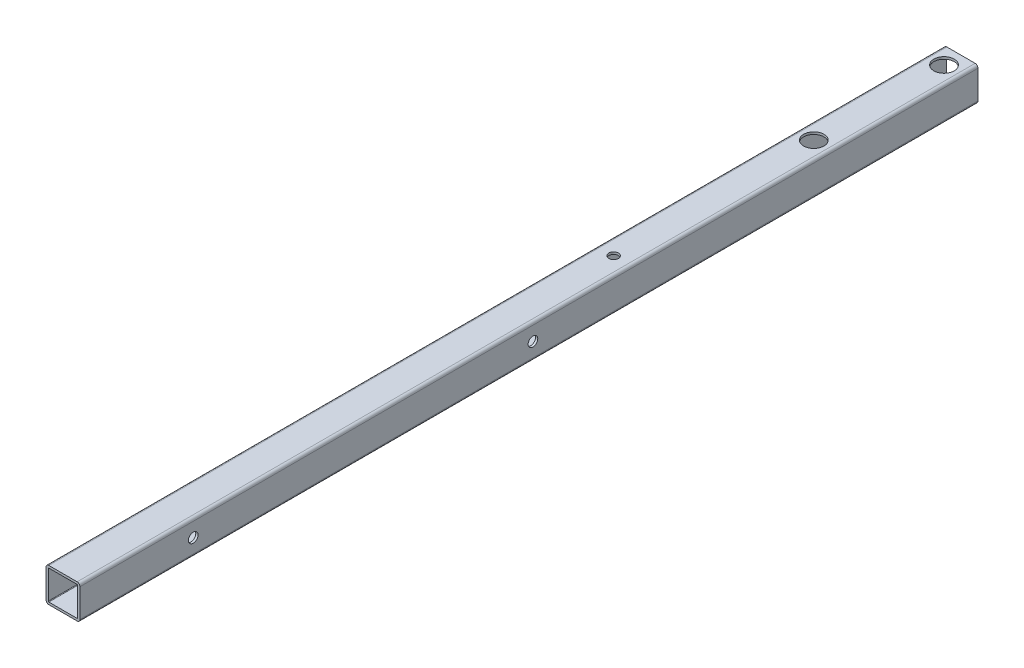
ISO-10303-21;
HEADER;
FILE_DESCRIPTION(('STEP AP214'),'2;1');
FILE_NAME('part.step','',(''),(''),'','','');
FILE_SCHEMA(('AUTOMOTIVE_DESIGN { 1 0 10303 214 1 1 1 1 }'));
ENDSEC;
DATA;
#1=APPLICATION_CONTEXT('core data for automotive mechanical design processes');
#2=APPLICATION_PROTOCOL_DEFINITION('international standard','automotive_design',2000,#1);
#3=PRODUCT_CONTEXT('',#1,'mechanical');
#4=PRODUCT('Part','Part','',(#3));
#5=PRODUCT_RELATED_PRODUCT_CATEGORY('part','',(#4));
#6=PRODUCT_DEFINITION_FORMATION('','',#4);
#7=PRODUCT_DEFINITION_CONTEXT('part definition',#1,'design');
#8=PRODUCT_DEFINITION('design','',#6,#7);
#9=PRODUCT_DEFINITION_SHAPE('','',#8);
#10=(LENGTH_UNIT() NAMED_UNIT(*) SI_UNIT(.MILLI.,.METRE.));
#11=(NAMED_UNIT(*) PLANE_ANGLE_UNIT() SI_UNIT($,.RADIAN.));
#12=(NAMED_UNIT(*) SI_UNIT($,.STERADIAN.) SOLID_ANGLE_UNIT());
#13=UNCERTAINTY_MEASURE_WITH_UNIT(LENGTH_MEASURE(1.E-05),#10,'distance_accuracy_value','');
#14=(GEOMETRIC_REPRESENTATION_CONTEXT(3) GLOBAL_UNCERTAINTY_ASSIGNED_CONTEXT((#13)) GLOBAL_UNIT_ASSIGNED_CONTEXT((#10,
#11,#12)) REPRESENTATION_CONTEXT('',''));
#15=CARTESIAN_POINT('',(0.,0.,0.));
#16=DIRECTION('',(0.,0.,1.));
#17=DIRECTION('',(1.,0.,0.));
#18=AXIS2_PLACEMENT_3D('',#15,#16,#17);
#19=CARTESIAN_POINT('',(0.0233047033624929,-15.,-89.7233047033634));
#20=DIRECTION('',(0.,-1.,0.));
#21=DIRECTION('',(0.,0.,-1.));
#22=AXIS2_PLACEMENT_3D('',#19,#20,#21);
#23=CYLINDRICAL_SURFACE('',#22,4.25);
#24=CARTESIAN_POINT('',(0.0233047033624929,-13.,-89.7233047033634));
#25=DIRECTION('',(0.,-1.,0.));
#26=DIRECTION('',(0.,0.,-1.));
#27=AXIS2_PLACEMENT_3D('',#24,#25,#26);
#28=CIRCLE('',#27,4.25);
#29=CARTESIAN_POINT('',(0.0233047033624929,-13.,-93.9733047033634));
#30=VERTEX_POINT('',#29);
#31=EDGE_CURVE('E180',#30,#30,#28,.T.);
#32=ORIENTED_EDGE('',*,*,#31,.F.);
#33=EDGE_LOOP('',(#32));
#34=FACE_BOUND('',#33,.T.);
#35=CARTESIAN_POINT('',(0.0233047033624929,-15.,-89.7233047033634));
#36=DIRECTION('',(0.,-1.,0.));
#37=DIRECTION('',(0.,0.,-1.));
#38=AXIS2_PLACEMENT_3D('',#35,#36,#37);
#39=CIRCLE('',#38,4.25);
#40=CARTESIAN_POINT('',(0.0233047033624929,-15.,-93.9733047033634));
#41=VERTEX_POINT('',#40);
#42=EDGE_CURVE('E186',#41,#41,#39,.T.);
#43=ORIENTED_EDGE('',*,*,#42,.T.);
#44=EDGE_LOOP('',(#43));
#45=FACE_BOUND('',#44,.T.);
#46=ADVANCED_FACE('F16',(#34,#45),#23,.F.);
#47=CARTESIAN_POINT('',(0.,-15.,-266.5));
#48=DIRECTION('',(0.,1.,0.));
#49=DIRECTION('',(0.,0.,1.));
#50=AXIS2_PLACEMENT_3D('',#47,#48,#49);
#51=CYLINDRICAL_SURFACE('',#50,4.25000000000003);
#52=CARTESIAN_POINT('',(0.,-13.,-266.5));
#53=DIRECTION('',(0.,1.,0.));
#54=DIRECTION('',(0.,0.,1.));
#55=AXIS2_PLACEMENT_3D('',#52,#53,#54);
#56=CIRCLE('',#55,4.25000000000003);
#57=CARTESIAN_POINT('',(0.,-13.,-262.25));
#58=VERTEX_POINT('',#57);
#59=EDGE_CURVE('E248',#58,#58,#56,.F.);
#60=ORIENTED_EDGE('',*,*,#59,.F.);
#61=EDGE_LOOP('',(#60));
#62=FACE_BOUND('',#61,.T.);
#63=CARTESIAN_POINT('',(0.,-15.,-266.5));
#64=DIRECTION('',(0.,1.,0.));
#65=DIRECTION('',(0.,0.,1.));
#66=AXIS2_PLACEMENT_3D('',#63,#64,#65);
#67=CIRCLE('',#66,4.25000000000003);
#68=CARTESIAN_POINT('',(0.,-15.,-262.25));
#69=VERTEX_POINT('',#68);
#70=EDGE_CURVE('E255',#69,#69,#67,.F.);
#71=ORIENTED_EDGE('',*,*,#70,.T.);
#72=EDGE_LOOP('',(#71));
#73=FACE_BOUND('',#72,.T.);
#74=ADVANCED_FACE('F585',(#62,#73),#51,.F.);
#75=CARTESIAN_POINT('',(0.,-15.,-381.5));
#76=DIRECTION('',(0.,1.,0.));
#77=DIRECTION('',(0.,0.,1.));
#78=AXIS2_PLACEMENT_3D('',#75,#76,#77);
#79=CYLINDRICAL_SURFACE('',#78,4.25000000000003);
#80=CARTESIAN_POINT('',(0.,-13.,-381.5));
#81=DIRECTION('',(0.,1.,0.));
#82=DIRECTION('',(0.,0.,1.));
#83=AXIS2_PLACEMENT_3D('',#80,#81,#82);
#84=CIRCLE('',#83,4.25000000000003);
#85=CARTESIAN_POINT('',(0.,-13.,-377.25));
#86=VERTEX_POINT('',#85);
#87=EDGE_CURVE('E131',#86,#86,#84,.F.);
#88=ORIENTED_EDGE('',*,*,#87,.F.);
#89=EDGE_LOOP('',(#88));
#90=FACE_BOUND('',#89,.T.);
#91=CARTESIAN_POINT('',(0.,-15.,-381.5));
#92=DIRECTION('',(0.,1.,0.));
#93=DIRECTION('',(0.,0.,1.));
#94=AXIS2_PLACEMENT_3D('',#91,#92,#93);
#95=CIRCLE('',#94,4.25000000000003);
#96=CARTESIAN_POINT('',(0.,-15.,-377.25));
#97=VERTEX_POINT('',#96);
#98=EDGE_CURVE('E183',#97,#97,#95,.F.);
#99=ORIENTED_EDGE('',*,*,#98,.T.);
#100=EDGE_LOOP('',(#99));
#101=FACE_BOUND('',#100,.T.);
#102=ADVANCED_FACE('F577',(#90,#101),#79,.F.);
#103=CARTESIAN_POINT('',(-12.5,-12.5,396.5));
#104=DIRECTION('',(0.,0.,-1.));
#105=DIRECTION('',(-1.,0.,0.));
#106=AXIS2_PLACEMENT_3D('',#103,#104,#105);
#107=CYLINDRICAL_SURFACE('',#106,0.499999999999995);
#108=DIRECTION('',(0.,0.,-1.));
#109=VECTOR('',#108,1.);
#110=CARTESIAN_POINT('',(-13.,-12.5,396.5));
#111=LINE('',#110,#109);
#112=CARTESIAN_POINT('',(-13.,-12.5,396.5));
#113=VERTEX_POINT('',#112);
#114=CARTESIAN_POINT('',(-13.,-12.5,-396.5));
#115=VERTEX_POINT('',#114);
#116=EDGE_CURVE('E116',#113,#115,#111,.T.);
#117=ORIENTED_EDGE('',*,*,#116,.F.);
#118=CARTESIAN_POINT('',(-12.5,-12.5,396.5));
#119=DIRECTION('',(0.,0.,-1.));
#120=DIRECTION('',(-1.,0.,0.));
#121=AXIS2_PLACEMENT_3D('',#118,#119,#120);
#122=CIRCLE('',#121,0.499999999999995);
#123=CARTESIAN_POINT('',(-12.5,-13.,396.5));
#124=VERTEX_POINT('',#123);
#125=EDGE_CURVE('E19',#124,#113,#122,.T.);
#126=ORIENTED_EDGE('',*,*,#125,.F.);
#127=DIRECTION('',(0.,0.,1.));
#128=VECTOR('',#127,1.);
#129=CARTESIAN_POINT('',(-12.5,-13.,396.5));
#130=LINE('',#129,#128);
#131=CARTESIAN_POINT('',(-12.5,-13.,-396.5));
#132=VERTEX_POINT('',#131);
#133=EDGE_CURVE('E113',#132,#124,#130,.T.);
#134=ORIENTED_EDGE('',*,*,#133,.F.);
#135=CARTESIAN_POINT('',(-12.5,-12.5,-396.5));
#136=DIRECTION('',(0.,0.,-1.));
#137=DIRECTION('',(-1.,0.,0.));
#138=AXIS2_PLACEMENT_3D('',#135,#136,#137);
#139=CIRCLE('',#138,0.499999999999995);
#140=EDGE_CURVE('E121',#115,#132,#139,.F.);
#141=ORIENTED_EDGE('',*,*,#140,.F.);
#142=EDGE_LOOP('',(#117,#126,#134,#141));
#143=FACE_BOUND('',#142,.T.);
#144=ADVANCED_FACE('F112',(#143),#107,.F.);
#145=CARTESIAN_POINT('',(-15.,0.,296.5));
#146=DIRECTION('',(1.,0.,0.));
#147=DIRECTION('',(0.,0.,-1.));
#148=AXIS2_PLACEMENT_3D('',#145,#146,#147);
#149=CYLINDRICAL_SURFACE('',#148,4.24999999999998);
#150=CARTESIAN_POINT('',(13.,0.,296.5));
#151=DIRECTION('',(1.,0.,0.));
#152=DIRECTION('',(0.,0.,-1.));
#153=AXIS2_PLACEMENT_3D('',#150,#151,#152);
#154=CIRCLE('',#153,4.24999999999998);
#155=CARTESIAN_POINT('',(13.,0.,292.25));
#156=VERTEX_POINT('',#155);
#157=EDGE_CURVE('E174',#156,#156,#154,.T.);
#158=ORIENTED_EDGE('',*,*,#157,.F.);
#159=EDGE_LOOP('',(#158));
#160=FACE_BOUND('',#159,.T.);
#161=CARTESIAN_POINT('',(15.,0.,296.5));
#162=DIRECTION('',(1.,0.,0.));
#163=DIRECTION('',(0.,0.,-1.));
#164=AXIS2_PLACEMENT_3D('',#161,#162,#163);
#165=CIRCLE('',#164,4.24999999999998);
#166=CARTESIAN_POINT('',(15.,0.,292.25));
#167=VERTEX_POINT('',#166);
#168=EDGE_CURVE('E193',#167,#167,#165,.T.);
#169=ORIENTED_EDGE('',*,*,#168,.T.);
#170=EDGE_LOOP('',(#169));
#171=FACE_BOUND('',#170,.T.);
#172=ADVANCED_FACE('F343',(#160,#171),#149,.F.);
#173=CARTESIAN_POINT('',(-15.,0.,-3.5));
#174=DIRECTION('',(1.,0.,0.));
#175=DIRECTION('',(0.,0.,-1.));
#176=AXIS2_PLACEMENT_3D('',#173,#174,#175);
#177=CYLINDRICAL_SURFACE('',#176,4.25000000000001);
#178=CARTESIAN_POINT('',(13.,0.,-3.5));
#179=DIRECTION('',(1.,0.,0.));
#180=DIRECTION('',(0.,0.,-1.));
#181=AXIS2_PLACEMENT_3D('',#178,#179,#180);
#182=CIRCLE('',#181,4.25000000000001);
#183=CARTESIAN_POINT('',(13.,0.,-7.75000000000001));
#184=VERTEX_POINT('',#183);
#185=EDGE_CURVE('E169',#184,#184,#182,.T.);
#186=ORIENTED_EDGE('',*,*,#185,.F.);
#187=EDGE_LOOP('',(#186));
#188=FACE_BOUND('',#187,.T.);
#189=CARTESIAN_POINT('',(15.,0.,-3.5));
#190=DIRECTION('',(1.,0.,0.));
#191=DIRECTION('',(0.,0.,-1.));
#192=AXIS2_PLACEMENT_3D('',#189,#190,#191);
#193=CIRCLE('',#192,4.25000000000001);
#194=CARTESIAN_POINT('',(15.,0.,-7.75000000000001));
#195=VERTEX_POINT('',#194);
#196=EDGE_CURVE('E190',#195,#195,#193,.T.);
#197=ORIENTED_EDGE('',*,*,#196,.T.);
#198=EDGE_LOOP('',(#197));
#199=FACE_BOUND('',#198,.T.);
#200=ADVANCED_FACE('F333',(#188,#199),#177,.F.);
#201=CARTESIAN_POINT('',(12.5,-12.5,396.5));
#202=DIRECTION('',(0.,0.,-1.));
#203=DIRECTION('',(-1.,0.,0.));
#204=AXIS2_PLACEMENT_3D('',#201,#202,#203);
#205=CYLINDRICAL_SURFACE('',#204,0.499999999999999);
#206=DIRECTION('',(0.,0.,1.));
#207=VECTOR('',#206,1.);
#208=CARTESIAN_POINT('',(12.5,-13.,396.5));
#209=LINE('',#208,#207);
#210=CARTESIAN_POINT('',(12.5,-13.,396.5));
#211=VERTEX_POINT('',#210);
#212=CARTESIAN_POINT('',(12.5,-13.,-396.5));
#213=VERTEX_POINT('',#212);
#214=EDGE_CURVE('E130',#211,#213,#209,.F.);
#215=ORIENTED_EDGE('',*,*,#214,.F.);
#216=CARTESIAN_POINT('',(12.5,-12.5,396.5));
#217=DIRECTION('',(0.,0.,-1.));
#218=DIRECTION('',(-1.,0.,0.));
#219=AXIS2_PLACEMENT_3D('',#216,#217,#218);
#220=CIRCLE('',#219,0.499999999999999);
#221=CARTESIAN_POINT('',(13.,-12.5,396.5));
#222=VERTEX_POINT('',#221);
#223=EDGE_CURVE('E136',#222,#211,#220,.T.);
#224=ORIENTED_EDGE('',*,*,#223,.F.);
#225=DIRECTION('',(0.,0.,1.));
#226=VECTOR('',#225,1.);
#227=CARTESIAN_POINT('',(13.,-12.5,396.5));
#228=LINE('',#227,#226);
#229=CARTESIAN_POINT('',(13.,-12.5,-396.5));
#230=VERTEX_POINT('',#229);
#231=EDGE_CURVE('E165',#230,#222,#228,.T.);
#232=ORIENTED_EDGE('',*,*,#231,.F.);
#233=CARTESIAN_POINT('',(12.5,-12.5,-396.5));
#234=DIRECTION('',(0.,0.,-1.));
#235=DIRECTION('',(-1.,0.,0.));
#236=AXIS2_PLACEMENT_3D('',#233,#234,#235);
#237=CIRCLE('',#236,0.499999999999999);
#238=EDGE_CURVE('E280',#213,#230,#237,.F.);
#239=ORIENTED_EDGE('',*,*,#238,.F.);
#240=EDGE_LOOP('',(#215,#224,#232,#239));
#241=FACE_BOUND('',#240,.T.);
#242=ADVANCED_FACE('F330',(#241),#205,.F.);
#243=CARTESIAN_POINT('',(0.0233047033624929,-15.,-89.7233047033634));
#244=DIRECTION('',(0.,-1.,0.));
#245=DIRECTION('',(0.,0.,-1.));
#246=AXIS2_PLACEMENT_3D('',#243,#244,#245);
#247=CYLINDRICAL_SURFACE('',#246,4.25);
#248=CARTESIAN_POINT('',(0.0233047033624929,13.,-89.7233047033634));
#249=DIRECTION('',(0.,-1.,0.));
#250=DIRECTION('',(0.,0.,-1.));
#251=AXIS2_PLACEMENT_3D('',#248,#249,#250);
#252=CIRCLE('',#251,4.25);
#253=CARTESIAN_POINT('',(0.0233047033624929,13.,-93.9733047033634));
#254=VERTEX_POINT('',#253);
#255=EDGE_CURVE('E171',#254,#254,#252,.F.);
#256=ORIENTED_EDGE('',*,*,#255,.F.);
#257=EDGE_LOOP('',(#256));
#258=FACE_BOUND('',#257,.T.);
#259=CARTESIAN_POINT('',(0.0233047033624929,15.,-89.7233047033634));
#260=DIRECTION('',(0.,-1.,0.));
#261=DIRECTION('',(0.,0.,-1.));
#262=AXIS2_PLACEMENT_3D('',#259,#260,#261);
#263=CIRCLE('',#262,4.25);
#264=CARTESIAN_POINT('',(0.0233047033624929,15.,-93.9733047033634));
#265=VERTEX_POINT('',#264);
#266=EDGE_CURVE('E269',#265,#265,#263,.F.);
#267=ORIENTED_EDGE('',*,*,#266,.T.);
#268=EDGE_LOOP('',(#267));
#269=FACE_BOUND('',#268,.T.);
#270=ADVANCED_FACE('F332',(#258,#269),#247,.F.);
#271=CARTESIAN_POINT('',(0.,-15.001,-266.5));
#272=DIRECTION('',(0.,1.,0.));
#273=DIRECTION('',(-1.,0.,0.));
#274=AXIS2_PLACEMENT_3D('',#271,#272,#273);
#275=CYLINDRICAL_SURFACE('',#274,9.00000000000002);
#276=CARTESIAN_POINT('',(0.,13.,-266.5));
#277=DIRECTION('',(0.,1.,0.));
#278=DIRECTION('',(-1.,0.,0.));
#279=AXIS2_PLACEMENT_3D('',#276,#277,#278);
#280=CIRCLE('',#279,9.00000000000002);
#281=CARTESIAN_POINT('',(-9.00000000000002,13.,-266.5));
#282=VERTEX_POINT('',#281);
#283=EDGE_CURVE('E161',#282,#282,#280,.T.);
#284=ORIENTED_EDGE('',*,*,#283,.F.);
#285=EDGE_LOOP('',(#284));
#286=FACE_BOUND('',#285,.T.);
#287=CARTESIAN_POINT('',(0.,15.,-266.5));
#288=DIRECTION('',(0.,1.,0.));
#289=DIRECTION('',(-1.,0.,0.));
#290=AXIS2_PLACEMENT_3D('',#287,#288,#289);
#291=CIRCLE('',#290,9.00000000000002);
#292=CARTESIAN_POINT('',(-9.00000000000002,15.,-266.5));
#293=VERTEX_POINT('',#292);
#294=EDGE_CURVE('E266',#293,#293,#291,.T.);
#295=ORIENTED_EDGE('',*,*,#294,.T.);
#296=EDGE_LOOP('',(#295));
#297=FACE_BOUND('',#296,.T.);
#298=ADVANCED_FACE('F340',(#286,#297),#275,.F.);
#299=CARTESIAN_POINT('',(12.5,12.5,396.5));
#300=DIRECTION('',(0.,0.,-1.));
#301=DIRECTION('',(-1.,0.,0.));
#302=AXIS2_PLACEMENT_3D('',#299,#300,#301);
#303=CYLINDRICAL_SURFACE('',#302,0.499999999999999);
#304=DIRECTION('',(0.,0.,1.));
#305=VECTOR('',#304,1.);
#306=CARTESIAN_POINT('',(13.,12.5,396.5));
#307=LINE('',#306,#305);
#308=CARTESIAN_POINT('',(13.,12.5,396.5));
#309=VERTEX_POINT('',#308);
#310=CARTESIAN_POINT('',(13.,12.5,-396.5));
#311=VERTEX_POINT('',#310);
#312=EDGE_CURVE('E168',#309,#311,#307,.F.);
#313=ORIENTED_EDGE('',*,*,#312,.F.);
#314=CARTESIAN_POINT('',(12.5,12.5,396.5));
#315=DIRECTION('',(0.,0.,-1.));
#316=DIRECTION('',(-1.,0.,0.));
#317=AXIS2_PLACEMENT_3D('',#314,#315,#316);
#318=CIRCLE('',#317,0.499999999999999);
#319=CARTESIAN_POINT('',(12.5,13.,396.5));
#320=VERTEX_POINT('',#319);
#321=EDGE_CURVE('E278',#320,#309,#318,.T.);
#322=ORIENTED_EDGE('',*,*,#321,.F.);
#323=DIRECTION('',(0.,0.,1.));
#324=VECTOR('',#323,1.);
#325=CARTESIAN_POINT('',(12.5,13.,396.5));
#326=LINE('',#325,#324);
#327=CARTESIAN_POINT('',(12.5,13.,-396.5));
#328=VERTEX_POINT('',#327);
#329=EDGE_CURVE('E157',#328,#320,#326,.T.);
#330=ORIENTED_EDGE('',*,*,#329,.F.);
#331=CARTESIAN_POINT('',(12.5,12.5,-396.5));
#332=DIRECTION('',(0.,0.,-1.));
#333=DIRECTION('',(-1.,0.,0.));
#334=AXIS2_PLACEMENT_3D('',#331,#332,#333);
#335=CIRCLE('',#334,0.499999999999999);
#336=EDGE_CURVE('E276',#311,#328,#335,.F.);
#337=ORIENTED_EDGE('',*,*,#336,.F.);
#338=EDGE_LOOP('',(#313,#322,#330,#337));
#339=FACE_BOUND('',#338,.T.);
#340=ADVANCED_FACE('F323',(#339),#303,.F.);
#341=CARTESIAN_POINT('',(-12.5,12.5,396.5));
#342=DIRECTION('',(0.,0.,-1.));
#343=DIRECTION('',(-1.,0.,0.));
#344=AXIS2_PLACEMENT_3D('',#341,#342,#343);
#345=CYLINDRICAL_SURFACE('',#344,0.499999999999995);
#346=DIRECTION('',(0.,0.,1.));
#347=VECTOR('',#346,1.);
#348=CARTESIAN_POINT('',(-12.5,13.,396.5));
#349=LINE('',#348,#347);
#350=CARTESIAN_POINT('',(-12.5,13.,396.5));
#351=VERTEX_POINT('',#350);
#352=CARTESIAN_POINT('',(-12.5,13.,-396.5));
#353=VERTEX_POINT('',#352);
#354=EDGE_CURVE('E160',#351,#353,#349,.F.);
#355=ORIENTED_EDGE('',*,*,#354,.F.);
#356=CARTESIAN_POINT('',(-12.5,12.5,396.5));
#357=DIRECTION('',(0.,0.,-1.));
#358=DIRECTION('',(-1.,0.,0.));
#359=AXIS2_PLACEMENT_3D('',#356,#357,#358);
#360=CIRCLE('',#359,0.499999999999995);
#361=CARTESIAN_POINT('',(-13.,12.5,396.5));
#362=VERTEX_POINT('',#361);
#363=EDGE_CURVE('E274',#362,#351,#360,.T.);
#364=ORIENTED_EDGE('',*,*,#363,.F.);
#365=DIRECTION('',(0.,0.,-1.));
#366=VECTOR('',#365,1.);
#367=CARTESIAN_POINT('',(-13.,12.5,396.5));
#368=LINE('',#367,#366);
#369=CARTESIAN_POINT('',(-13.,12.5,-396.5));
#370=VERTEX_POINT('',#369);
#371=EDGE_CURVE('E175',#370,#362,#368,.F.);
#372=ORIENTED_EDGE('',*,*,#371,.F.);
#373=CARTESIAN_POINT('',(-12.5,12.5,-396.5));
#374=DIRECTION('',(0.,0.,-1.));
#375=DIRECTION('',(-1.,0.,0.));
#376=AXIS2_PLACEMENT_3D('',#373,#374,#375);
#377=CIRCLE('',#376,0.499999999999995);
#378=EDGE_CURVE('E272',#353,#370,#377,.F.);
#379=ORIENTED_EDGE('',*,*,#378,.F.);
#380=EDGE_LOOP('',(#355,#364,#372,#379));
#381=FACE_BOUND('',#380,.T.);
#382=ADVANCED_FACE('F320',(#381),#345,.F.);
#383=CARTESIAN_POINT('',(0.,-15.001,-381.5));
#384=DIRECTION('',(0.,1.,0.));
#385=DIRECTION('',(-1.,0.,0.));
#386=AXIS2_PLACEMENT_3D('',#383,#384,#385);
#387=CYLINDRICAL_SURFACE('',#386,9.00000000000001);
#388=CARTESIAN_POINT('',(0.,13.,-381.5));
#389=DIRECTION('',(0.,1.,0.));
#390=DIRECTION('',(-1.,0.,0.));
#391=AXIS2_PLACEMENT_3D('',#388,#389,#390);
#392=CIRCLE('',#391,9.00000000000001);
#393=CARTESIAN_POINT('',(-9.00000000000001,13.,-381.5));
#394=VERTEX_POINT('',#393);
#395=EDGE_CURVE('E164',#394,#394,#392,.T.);
#396=ORIENTED_EDGE('',*,*,#395,.F.);
#397=EDGE_LOOP('',(#396));
#398=FACE_BOUND('',#397,.T.);
#399=CARTESIAN_POINT('',(0.,15.,-381.5));
#400=DIRECTION('',(0.,1.,0.));
#401=DIRECTION('',(-1.,0.,0.));
#402=AXIS2_PLACEMENT_3D('',#399,#400,#401);
#403=CIRCLE('',#402,9.00000000000001);
#404=CARTESIAN_POINT('',(-9.00000000000001,15.,-381.5));
#405=VERTEX_POINT('',#404);
#406=EDGE_CURVE('E194',#405,#405,#403,.T.);
#407=ORIENTED_EDGE('',*,*,#406,.T.);
#408=EDGE_LOOP('',(#407));
#409=FACE_BOUND('',#408,.T.);
#410=ADVANCED_FACE('F403',(#398,#409),#387,.F.);
#411=CARTESIAN_POINT('',(-12.5,15.,396.5));
#412=DIRECTION('',(0.,-1.,0.));
#413=DIRECTION('',(1.,0.,0.));
#414=AXIS2_PLACEMENT_3D('',#411,#412,#413);
#415=PLANE('',#414);
#416=ORIENTED_EDGE('',*,*,#406,.F.);
#417=EDGE_LOOP('',(#416));
#418=FACE_BOUND('',#417,.T.);
#419=DIRECTION('',(0.,0.,-1.));
#420=VECTOR('',#419,1.);
#421=CARTESIAN_POINT('',(-12.5,15.,396.5));
#422=LINE('',#421,#420);
#423=CARTESIAN_POINT('',(-12.5,15.,396.5));
#424=VERTEX_POINT('',#423);
#425=CARTESIAN_POINT('',(-12.5,15.,-396.5));
#426=VERTEX_POINT('',#425);
#427=EDGE_CURVE('E195',#424,#426,#422,.T.);
#428=ORIENTED_EDGE('',*,*,#427,.F.);
#429=DIRECTION('',(-1.,0.,0.));
#430=VECTOR('',#429,1.);
#431=CARTESIAN_POINT('',(-12.5,15.,396.5));
#432=LINE('',#431,#430);
#433=CARTESIAN_POINT('',(12.5,15.,396.5));
#434=VERTEX_POINT('',#433);
#435=EDGE_CURVE('E153',#424,#434,#432,.F.);
#436=ORIENTED_EDGE('',*,*,#435,.T.);
#437=DIRECTION('',(0.,0.,-1.));
#438=VECTOR('',#437,1.);
#439=CARTESIAN_POINT('',(12.5,15.,396.5));
#440=LINE('',#439,#438);
#441=CARTESIAN_POINT('',(12.5,15.,-396.5));
#442=VERTEX_POINT('',#441);
#443=EDGE_CURVE('E191',#442,#434,#440,.F.);
#444=ORIENTED_EDGE('',*,*,#443,.F.);
#445=DIRECTION('',(-1.,0.,0.));
#446=VECTOR('',#445,1.);
#447=CARTESIAN_POINT('',(-12.5,15.,-396.5));
#448=LINE('',#447,#446);
#449=EDGE_CURVE('E219',#426,#442,#448,.F.);
#450=ORIENTED_EDGE('',*,*,#449,.F.);
#451=EDGE_LOOP('',(#428,#436,#444,#450));
#452=FACE_BOUND('',#451,.T.);
#453=ORIENTED_EDGE('',*,*,#294,.F.);
#454=EDGE_LOOP('',(#453));
#455=FACE_BOUND('',#454,.T.);
#456=ORIENTED_EDGE('',*,*,#266,.F.);
#457=EDGE_LOOP('',(#456));
#458=FACE_BOUND('',#457,.T.);
#459=ADVANCED_FACE('F399',(#418,#452,#455,#458),#415,.F.);
#460=CARTESIAN_POINT('',(12.5,12.5,396.5));
#461=DIRECTION('',(0.,0.,-1.));
#462=DIRECTION('',(-1.,0.,0.));
#463=AXIS2_PLACEMENT_3D('',#460,#461,#462);
#464=CYLINDRICAL_SURFACE('',#463,2.5);
#465=CARTESIAN_POINT('',(12.5,12.5,396.5));
#466=DIRECTION('',(0.,0.,-1.));
#467=DIRECTION('',(-1.,0.,0.));
#468=AXIS2_PLACEMENT_3D('',#465,#466,#467);
#469=CIRCLE('',#468,2.5);
#470=CARTESIAN_POINT('',(15.,12.5,396.5));
#471=VERTEX_POINT('',#470);
#472=EDGE_CURVE('E152',#434,#471,#469,.T.);
#473=ORIENTED_EDGE('',*,*,#472,.T.);
#474=DIRECTION('',(0.,0.,1.));
#475=VECTOR('',#474,1.);
#476=CARTESIAN_POINT('',(15.,12.5,396.5));
#477=LINE('',#476,#475);
#478=CARTESIAN_POINT('',(15.,12.5,-396.5));
#479=VERTEX_POINT('',#478);
#480=EDGE_CURVE('E187',#471,#479,#477,.F.);
#481=ORIENTED_EDGE('',*,*,#480,.T.);
#482=CARTESIAN_POINT('',(12.5,12.5,-396.5));
#483=DIRECTION('',(0.,0.,-1.));
#484=DIRECTION('',(-1.,0.,0.));
#485=AXIS2_PLACEMENT_3D('',#482,#483,#484);
#486=CIRCLE('',#485,2.5);
#487=EDGE_CURVE('E216',#442,#479,#486,.T.);
#488=ORIENTED_EDGE('',*,*,#487,.F.);
#489=ORIENTED_EDGE('',*,*,#443,.T.);
#490=EDGE_LOOP('',(#473,#481,#488,#489));
#491=FACE_BOUND('',#490,.T.);
#492=ADVANCED_FACE('F395',(#491),#464,.T.);
#493=CARTESIAN_POINT('',(15.,-12.5,396.5));
#494=DIRECTION('',(-1.,0.,0.));
#495=DIRECTION('',(0.,-1.,0.));
#496=AXIS2_PLACEMENT_3D('',#493,#494,#495);
#497=PLANE('',#496);
#498=ORIENTED_EDGE('',*,*,#480,.F.);
#499=DIRECTION('',(0.,1.,0.));
#500=VECTOR('',#499,1.);
#501=CARTESIAN_POINT('',(15.,-12.5,396.5));
#502=LINE('',#501,#500);
#503=CARTESIAN_POINT('',(15.,-12.5,396.5));
#504=VERTEX_POINT('',#503);
#505=EDGE_CURVE('E149',#471,#504,#502,.F.);
#506=ORIENTED_EDGE('',*,*,#505,.T.);
#507=DIRECTION('',(0.,0.,-1.));
#508=VECTOR('',#507,1.);
#509=CARTESIAN_POINT('',(15.,-12.5,396.5));
#510=LINE('',#509,#508);
#511=CARTESIAN_POINT('',(15.,-12.5,-396.5));
#512=VERTEX_POINT('',#511);
#513=EDGE_CURVE('E184',#512,#504,#510,.F.);
#514=ORIENTED_EDGE('',*,*,#513,.F.);
#515=DIRECTION('',(0.,1.,0.));
#516=VECTOR('',#515,1.);
#517=CARTESIAN_POINT('',(15.,-12.5,-396.5));
#518=LINE('',#517,#516);
#519=EDGE_CURVE('E215',#479,#512,#518,.F.);
#520=ORIENTED_EDGE('',*,*,#519,.F.);
#521=EDGE_LOOP('',(#498,#506,#514,#520));
#522=FACE_BOUND('',#521,.T.);
#523=ORIENTED_EDGE('',*,*,#196,.F.);
#524=EDGE_LOOP('',(#523));
#525=FACE_BOUND('',#524,.T.);
#526=ORIENTED_EDGE('',*,*,#168,.F.);
#527=EDGE_LOOP('',(#526));
#528=FACE_BOUND('',#527,.T.);
#529=ADVANCED_FACE('F391',(#522,#525,#528),#497,.F.);
#530=CARTESIAN_POINT('',(12.5,-12.5,396.5));
#531=DIRECTION('',(0.,0.,-1.));
#532=DIRECTION('',(-1.,0.,0.));
#533=AXIS2_PLACEMENT_3D('',#530,#531,#532);
#534=CYLINDRICAL_SURFACE('',#533,2.50000000000001);
#535=CARTESIAN_POINT('',(12.5,-12.5,396.5));
#536=DIRECTION('',(0.,0.,-1.));
#537=DIRECTION('',(-1.,0.,0.));
#538=AXIS2_PLACEMENT_3D('',#535,#536,#537);
#539=CIRCLE('',#538,2.50000000000001);
#540=CARTESIAN_POINT('',(12.5,-15.,396.5));
#541=VERTEX_POINT('',#540);
#542=EDGE_CURVE('E145',#504,#541,#539,.T.);
#543=ORIENTED_EDGE('',*,*,#542,.T.);
#544=DIRECTION('',(0.,0.,1.));
#545=VECTOR('',#544,1.);
#546=CARTESIAN_POINT('',(12.5,-15.,396.5));
#547=LINE('',#546,#545);
#548=CARTESIAN_POINT('',(12.5,-15.,-396.5));
#549=VERTEX_POINT('',#548);
#550=EDGE_CURVE('E178',#541,#549,#547,.F.);
#551=ORIENTED_EDGE('',*,*,#550,.T.);
#552=CARTESIAN_POINT('',(12.5,-12.5,-396.5));
#553=DIRECTION('',(0.,0.,-1.));
#554=DIRECTION('',(-1.,0.,0.));
#555=AXIS2_PLACEMENT_3D('',#552,#553,#554);
#556=CIRCLE('',#555,2.50000000000001);
#557=EDGE_CURVE('E211',#512,#549,#556,.T.);
#558=ORIENTED_EDGE('',*,*,#557,.F.);
#559=ORIENTED_EDGE('',*,*,#513,.T.);
#560=EDGE_LOOP('',(#543,#551,#558,#559));
#561=FACE_BOUND('',#560,.T.);
#562=ADVANCED_FACE('F387',(#561),#534,.T.);
#563=CARTESIAN_POINT('',(-12.5,-15.,396.5));
#564=DIRECTION('',(0.,1.,0.));
#565=DIRECTION('',(-1.,0.,0.));
#566=AXIS2_PLACEMENT_3D('',#563,#564,#565);
#567=PLANE('',#566);
#568=ORIENTED_EDGE('',*,*,#550,.F.);
#569=DIRECTION('',(-1.,0.,0.));
#570=VECTOR('',#569,1.);
#571=CARTESIAN_POINT('',(-12.5,-15.,396.5));
#572=LINE('',#571,#570);
#573=CARTESIAN_POINT('',(-12.5,-15.,396.5));
#574=VERTEX_POINT('',#573);
#575=EDGE_CURVE('E139',#541,#574,#572,.T.);
#576=ORIENTED_EDGE('',*,*,#575,.T.);
#577=DIRECTION('',(0.,0.,-1.));
#578=VECTOR('',#577,1.);
#579=CARTESIAN_POINT('',(-12.5,-15.,396.5));
#580=LINE('',#579,#578);
#581=CARTESIAN_POINT('',(-12.5,-15.,-396.5));
#582=VERTEX_POINT('',#581);
#583=EDGE_CURVE('E199',#582,#574,#580,.F.);
#584=ORIENTED_EDGE('',*,*,#583,.F.);
#585=DIRECTION('',(-1.,0.,0.));
#586=VECTOR('',#585,1.);
#587=CARTESIAN_POINT('',(-12.5,-15.,-396.5));
#588=LINE('',#587,#586);
#589=EDGE_CURVE('E214',#549,#582,#588,.T.);
#590=ORIENTED_EDGE('',*,*,#589,.F.);
#591=EDGE_LOOP('',(#568,#576,#584,#590));
#592=FACE_BOUND('',#591,.T.);
#593=ORIENTED_EDGE('',*,*,#98,.F.);
#594=EDGE_LOOP('',(#593));
#595=FACE_BOUND('',#594,.T.);
#596=ORIENTED_EDGE('',*,*,#70,.F.);
#597=EDGE_LOOP('',(#596));
#598=FACE_BOUND('',#597,.T.);
#599=ORIENTED_EDGE('',*,*,#42,.F.);
#600=EDGE_LOOP('',(#599));
#601=FACE_BOUND('',#600,.T.);
#602=ADVANCED_FACE('F384',(#592,#595,#598,#601),#567,.F.);
#603=CARTESIAN_POINT('',(-13.,-12.5,396.5));
#604=DIRECTION('',(1.,0.,0.));
#605=DIRECTION('',(0.,0.,-1.));
#606=AXIS2_PLACEMENT_3D('',#603,#604,#605);
#607=PLANE('',#606);
#608=DIRECTION('',(0.,1.,0.));
#609=VECTOR('',#608,1.);
#610=CARTESIAN_POINT('',(-13.,-12.5,396.5));
#611=LINE('',#610,#609);
#612=EDGE_CURVE('E202',#362,#113,#611,.F.);
#613=ORIENTED_EDGE('',*,*,#612,.T.);
#614=ORIENTED_EDGE('',*,*,#116,.T.);
#615=DIRECTION('',(0.,1.,0.));
#616=VECTOR('',#615,1.);
#617=CARTESIAN_POINT('',(-13.,-12.5,-396.5));
#618=LINE('',#617,#616);
#619=EDGE_CURVE('E287',#370,#115,#618,.F.);
#620=ORIENTED_EDGE('',*,*,#619,.F.);
#621=ORIENTED_EDGE('',*,*,#371,.T.);
#622=EDGE_LOOP('',(#613,#614,#620,#621));
#623=FACE_BOUND('',#622,.T.);
#624=CARTESIAN_POINT('',(-13.,0.,-3.5));
#625=DIRECTION('',(1.,0.,0.));
#626=DIRECTION('',(0.,0.,-1.));
#627=AXIS2_PLACEMENT_3D('',#624,#625,#626);
#628=CIRCLE('',#627,4.25000000000001);
#629=CARTESIAN_POINT('',(-13.,0.,-7.75000000000001));
#630=VERTEX_POINT('',#629);
#631=EDGE_CURVE('E198',#630,#630,#628,.F.);
#632=ORIENTED_EDGE('',*,*,#631,.T.);
#633=EDGE_LOOP('',(#632));
#634=FACE_BOUND('',#633,.T.);
#635=CARTESIAN_POINT('',(-13.,0.,296.5));
#636=DIRECTION('',(1.,0.,0.));
#637=DIRECTION('',(0.,0.,-1.));
#638=AXIS2_PLACEMENT_3D('',#635,#636,#637);
#639=CIRCLE('',#638,4.24999999999998);
#640=CARTESIAN_POINT('',(-13.,0.,292.25));
#641=VERTEX_POINT('',#640);
#642=EDGE_CURVE('E233',#641,#641,#639,.F.);
#643=ORIENTED_EDGE('',*,*,#642,.T.);
#644=EDGE_LOOP('',(#643));
#645=FACE_BOUND('',#644,.T.);
#646=ADVANCED_FACE('F289',(#623,#634,#645),#607,.T.);
#647=CARTESIAN_POINT('',(-12.5,-13.,396.5));
#648=DIRECTION('',(0.,1.,0.));
#649=DIRECTION('',(-1.,0.,0.));
#650=AXIS2_PLACEMENT_3D('',#647,#648,#649);
#651=PLANE('',#650);
#652=DIRECTION('',(-1.,0.,0.));
#653=VECTOR('',#652,1.);
#654=CARTESIAN_POINT('',(-12.5,-13.,396.5));
#655=LINE('',#654,#653);
#656=EDGE_CURVE('E127',#124,#211,#655,.F.);
#657=ORIENTED_EDGE('',*,*,#656,.T.);
#658=ORIENTED_EDGE('',*,*,#214,.T.);
#659=DIRECTION('',(-1.,0.,0.));
#660=VECTOR('',#659,1.);
#661=CARTESIAN_POINT('',(-12.5,-13.,-396.5));
#662=LINE('',#661,#660);
#663=EDGE_CURVE('E129',#132,#213,#662,.F.);
#664=ORIENTED_EDGE('',*,*,#663,.F.);
#665=ORIENTED_EDGE('',*,*,#133,.T.);
#666=EDGE_LOOP('',(#657,#658,#664,#665));
#667=FACE_BOUND('',#666,.T.);
#668=ORIENTED_EDGE('',*,*,#87,.T.);
#669=EDGE_LOOP('',(#668));
#670=FACE_BOUND('',#669,.T.);
#671=ORIENTED_EDGE('',*,*,#59,.T.);
#672=EDGE_LOOP('',(#671));
#673=FACE_BOUND('',#672,.T.);
#674=ORIENTED_EDGE('',*,*,#31,.T.);
#675=EDGE_LOOP('',(#674));
#676=FACE_BOUND('',#675,.T.);
#677=ADVANCED_FACE('F124',(#667,#670,#673,#676),#651,.T.);
#678=CARTESIAN_POINT('',(13.,-12.5,396.5));
#679=DIRECTION('',(-1.,0.,0.));
#680=DIRECTION('',(0.,0.,1.));
#681=AXIS2_PLACEMENT_3D('',#678,#679,#680);
#682=PLANE('',#681);
#683=DIRECTION('',(0.,1.,0.));
#684=VECTOR('',#683,1.);
#685=CARTESIAN_POINT('',(13.,-12.5,396.5));
#686=LINE('',#685,#684);
#687=EDGE_CURVE('E138',#222,#309,#686,.T.);
#688=ORIENTED_EDGE('',*,*,#687,.T.);
#689=ORIENTED_EDGE('',*,*,#312,.T.);
#690=DIRECTION('',(0.,1.,0.));
#691=VECTOR('',#690,1.);
#692=CARTESIAN_POINT('',(13.,-12.5,-396.5));
#693=LINE('',#692,#691);
#694=EDGE_CURVE('E309',#230,#311,#693,.T.);
#695=ORIENTED_EDGE('',*,*,#694,.F.);
#696=ORIENTED_EDGE('',*,*,#231,.T.);
#697=EDGE_LOOP('',(#688,#689,#695,#696));
#698=FACE_BOUND('',#697,.T.);
#699=ORIENTED_EDGE('',*,*,#185,.T.);
#700=EDGE_LOOP('',(#699));
#701=FACE_BOUND('',#700,.T.);
#702=ORIENTED_EDGE('',*,*,#157,.T.);
#703=EDGE_LOOP('',(#702));
#704=FACE_BOUND('',#703,.T.);
#705=ADVANCED_FACE('F326',(#698,#701,#704),#682,.T.);
#706=CARTESIAN_POINT('',(-12.5,13.,396.5));
#707=DIRECTION('',(0.,-1.,0.));
#708=DIRECTION('',(1.,0.,0.));
#709=AXIS2_PLACEMENT_3D('',#706,#707,#708);
#710=PLANE('',#709);
#711=ORIENTED_EDGE('',*,*,#395,.T.);
#712=EDGE_LOOP('',(#711));
#713=FACE_BOUND('',#712,.T.);
#714=DIRECTION('',(-1.,0.,0.));
#715=VECTOR('',#714,1.);
#716=CARTESIAN_POINT('',(-12.5,13.,396.5));
#717=LINE('',#716,#715);
#718=EDGE_CURVE('E142',#320,#351,#717,.T.);
#719=ORIENTED_EDGE('',*,*,#718,.T.);
#720=ORIENTED_EDGE('',*,*,#354,.T.);
#721=DIRECTION('',(-1.,0.,0.));
#722=VECTOR('',#721,1.);
#723=CARTESIAN_POINT('',(-12.5,13.,-396.5));
#724=LINE('',#723,#722);
#725=EDGE_CURVE('E210',#328,#353,#724,.T.);
#726=ORIENTED_EDGE('',*,*,#725,.F.);
#727=ORIENTED_EDGE('',*,*,#329,.T.);
#728=EDGE_LOOP('',(#719,#720,#726,#727));
#729=FACE_BOUND('',#728,.T.);
#730=ORIENTED_EDGE('',*,*,#283,.T.);
#731=EDGE_LOOP('',(#730));
#732=FACE_BOUND('',#731,.T.);
#733=ORIENTED_EDGE('',*,*,#255,.T.);
#734=EDGE_LOOP('',(#733));
#735=FACE_BOUND('',#734,.T.);
#736=ADVANCED_FACE('F315',(#713,#729,#732,#735),#710,.T.);
#737=CARTESIAN_POINT('',(-15.,0.,296.5));
#738=DIRECTION('',(1.,0.,0.));
#739=DIRECTION('',(0.,0.,-1.));
#740=AXIS2_PLACEMENT_3D('',#737,#738,#739);
#741=CYLINDRICAL_SURFACE('',#740,4.24999999999998);
#742=CARTESIAN_POINT('',(-15.,0.,296.5));
#743=DIRECTION('',(1.,0.,0.));
#744=DIRECTION('',(0.,0.,-1.));
#745=AXIS2_PLACEMENT_3D('',#742,#743,#744);
#746=CIRCLE('',#745,4.24999999999998);
#747=CARTESIAN_POINT('',(-15.,0.,292.25));
#748=VERTEX_POINT('',#747);
#749=EDGE_CURVE('E207',#748,#748,#746,.F.);
#750=ORIENTED_EDGE('',*,*,#749,.T.);
#751=EDGE_LOOP('',(#750));
#752=FACE_BOUND('',#751,.T.);
#753=ORIENTED_EDGE('',*,*,#642,.F.);
#754=EDGE_LOOP('',(#753));
#755=FACE_BOUND('',#754,.T.);
#756=ADVANCED_FACE('F370',(#752,#755),#741,.F.);
#757=CARTESIAN_POINT('',(-15.,0.,-3.5));
#758=DIRECTION('',(1.,0.,0.));
#759=DIRECTION('',(0.,0.,-1.));
#760=AXIS2_PLACEMENT_3D('',#757,#758,#759);
#761=CYLINDRICAL_SURFACE('',#760,4.25000000000001);
#762=CARTESIAN_POINT('',(-15.,0.,-3.5));
#763=DIRECTION('',(1.,0.,0.));
#764=DIRECTION('',(0.,0.,-1.));
#765=AXIS2_PLACEMENT_3D('',#762,#763,#764);
#766=CIRCLE('',#765,4.25000000000001);
#767=CARTESIAN_POINT('',(-15.,0.,-7.75000000000001));
#768=VERTEX_POINT('',#767);
#769=EDGE_CURVE('E203',#768,#768,#766,.F.);
#770=ORIENTED_EDGE('',*,*,#769,.T.);
#771=EDGE_LOOP('',(#770));
#772=FACE_BOUND('',#771,.T.);
#773=ORIENTED_EDGE('',*,*,#631,.F.);
#774=EDGE_LOOP('',(#773));
#775=FACE_BOUND('',#774,.T.);
#776=ADVANCED_FACE('F366',(#772,#775),#761,.F.);
#777=CARTESIAN_POINT('',(-12.5,12.5,396.5));
#778=DIRECTION('',(0.,0.,-1.));
#779=DIRECTION('',(-1.,0.,0.));
#780=AXIS2_PLACEMENT_3D('',#777,#778,#779);
#781=CYLINDRICAL_SURFACE('',#780,2.5);
#782=CARTESIAN_POINT('',(-12.5,12.5,396.5));
#783=DIRECTION('',(0.,0.,-1.));
#784=DIRECTION('',(-1.,0.,0.));
#785=AXIS2_PLACEMENT_3D('',#782,#783,#784);
#786=CIRCLE('',#785,2.5);
#787=CARTESIAN_POINT('',(-15.,12.5,396.5));
#788=VERTEX_POINT('',#787);
#789=EDGE_CURVE('E156',#788,#424,#786,.T.);
#790=ORIENTED_EDGE('',*,*,#789,.T.);
#791=ORIENTED_EDGE('',*,*,#427,.T.);
#792=CARTESIAN_POINT('',(-12.5,12.5,-396.5));
#793=DIRECTION('',(0.,0.,-1.));
#794=DIRECTION('',(-1.,0.,0.));
#795=AXIS2_PLACEMENT_3D('',#792,#793,#794);
#796=CIRCLE('',#795,2.5);
#797=CARTESIAN_POINT('',(-15.,12.5,-396.5));
#798=VERTEX_POINT('',#797);
#799=EDGE_CURVE('E220',#798,#426,#796,.T.);
#800=ORIENTED_EDGE('',*,*,#799,.F.);
#801=DIRECTION('',(0.,0.,-1.));
#802=VECTOR('',#801,1.);
#803=CARTESIAN_POINT('',(-15.,12.5,396.5));
#804=LINE('',#803,#802);
#805=EDGE_CURVE('E206',#798,#788,#804,.F.);
#806=ORIENTED_EDGE('',*,*,#805,.T.);
#807=EDGE_LOOP('',(#790,#791,#800,#806));
#808=FACE_BOUND('',#807,.T.);
#809=ADVANCED_FACE('F363',(#808),#781,.T.);
#810=CARTESIAN_POINT('',(-12.5,-12.5,396.5));
#811=DIRECTION('',(0.,0.,-1.));
#812=DIRECTION('',(-1.,0.,0.));
#813=AXIS2_PLACEMENT_3D('',#810,#811,#812);
#814=PLANE('',#813);
#815=ORIENTED_EDGE('',*,*,#612,.F.);
#816=ORIENTED_EDGE('',*,*,#363,.T.);
#817=ORIENTED_EDGE('',*,*,#718,.F.);
#818=ORIENTED_EDGE('',*,*,#321,.T.);
#819=ORIENTED_EDGE('',*,*,#687,.F.);
#820=ORIENTED_EDGE('',*,*,#223,.T.);
#821=ORIENTED_EDGE('',*,*,#656,.F.);
#822=ORIENTED_EDGE('',*,*,#125,.T.);
#823=EDGE_LOOP('',(#815,#816,#817,#818,#819,#820,#821,#822));
#824=FACE_BOUND('',#823,.T.);
#825=ORIENTED_EDGE('',*,*,#575,.F.);
#826=ORIENTED_EDGE('',*,*,#542,.F.);
#827=ORIENTED_EDGE('',*,*,#505,.F.);
#828=ORIENTED_EDGE('',*,*,#472,.F.);
#829=ORIENTED_EDGE('',*,*,#435,.F.);
#830=ORIENTED_EDGE('',*,*,#789,.F.);
#831=DIRECTION('',(0.,1.,0.));
#832=VECTOR('',#831,1.);
#833=CARTESIAN_POINT('',(-15.,-12.5,396.5));
#834=LINE('',#833,#832);
#835=CARTESIAN_POINT('',(-15.,-12.5,396.5));
#836=VERTEX_POINT('',#835);
#837=EDGE_CURVE('E295',#788,#836,#834,.F.);
#838=ORIENTED_EDGE('',*,*,#837,.T.);
#839=CARTESIAN_POINT('',(-12.5,-12.5,396.5));
#840=DIRECTION('',(0.,0.,-1.));
#841=DIRECTION('',(-1.,0.,0.));
#842=AXIS2_PLACEMENT_3D('',#839,#840,#841);
#843=CIRCLE('',#842,2.5);
#844=EDGE_CURVE('E201',#574,#836,#843,.T.);
#845=ORIENTED_EDGE('',*,*,#844,.F.);
#846=EDGE_LOOP('',(#825,#826,#827,#828,#829,#830,#838,#845));
#847=FACE_BOUND('',#846,.T.);
#848=ADVANCED_FACE('F133',(#824,#847),#814,.F.);
#849=CARTESIAN_POINT('',(-12.5,-12.5,396.5));
#850=DIRECTION('',(0.,0.,-1.));
#851=DIRECTION('',(-1.,0.,0.));
#852=AXIS2_PLACEMENT_3D('',#849,#850,#851);
#853=CYLINDRICAL_SURFACE('',#852,2.5);
#854=ORIENTED_EDGE('',*,*,#844,.T.);
#855=DIRECTION('',(0.,0.,-1.));
#856=VECTOR('',#855,1.);
#857=CARTESIAN_POINT('',(-15.,-12.5,396.5));
#858=LINE('',#857,#856);
#859=CARTESIAN_POINT('',(-15.,-12.5,-396.5));
#860=VERTEX_POINT('',#859);
#861=EDGE_CURVE('E25',#836,#860,#858,.T.);
#862=ORIENTED_EDGE('',*,*,#861,.T.);
#863=CARTESIAN_POINT('',(-12.5,-12.5,-396.5));
#864=DIRECTION('',(0.,0.,-1.));
#865=DIRECTION('',(-1.,0.,0.));
#866=AXIS2_PLACEMENT_3D('',#863,#864,#865);
#867=CIRCLE('',#866,2.5);
#868=EDGE_CURVE('E33',#582,#860,#867,.T.);
#869=ORIENTED_EDGE('',*,*,#868,.F.);
#870=ORIENTED_EDGE('',*,*,#583,.T.);
#871=EDGE_LOOP('',(#854,#862,#869,#870));
#872=FACE_BOUND('',#871,.T.);
#873=ADVANCED_FACE('F353',(#872),#853,.T.);
#874=CARTESIAN_POINT('',(-12.5,-12.5,-396.5));
#875=DIRECTION('',(0.,0.,-1.));
#876=DIRECTION('',(-1.,0.,0.));
#877=AXIS2_PLACEMENT_3D('',#874,#875,#876);
#878=PLANE('',#877);
#879=ORIENTED_EDGE('',*,*,#725,.T.);
#880=ORIENTED_EDGE('',*,*,#378,.T.);
#881=ORIENTED_EDGE('',*,*,#619,.T.);
#882=ORIENTED_EDGE('',*,*,#140,.T.);
#883=ORIENTED_EDGE('',*,*,#663,.T.);
#884=ORIENTED_EDGE('',*,*,#238,.T.);
#885=ORIENTED_EDGE('',*,*,#694,.T.);
#886=ORIENTED_EDGE('',*,*,#336,.T.);
#887=EDGE_LOOP('',(#879,#880,#881,#882,#883,#884,#885,#886));
#888=FACE_BOUND('',#887,.T.);
#889=ORIENTED_EDGE('',*,*,#557,.T.);
#890=ORIENTED_EDGE('',*,*,#589,.T.);
#891=ORIENTED_EDGE('',*,*,#868,.T.);
#892=DIRECTION('',(0.,1.,0.));
#893=VECTOR('',#892,1.);
#894=CARTESIAN_POINT('',(-15.,-12.5,-396.5));
#895=LINE('',#894,#893);
#896=EDGE_CURVE('E11',#860,#798,#895,.T.);
#897=ORIENTED_EDGE('',*,*,#896,.T.);
#898=ORIENTED_EDGE('',*,*,#799,.T.);
#899=ORIENTED_EDGE('',*,*,#449,.T.);
#900=ORIENTED_EDGE('',*,*,#487,.T.);
#901=ORIENTED_EDGE('',*,*,#519,.T.);
#902=EDGE_LOOP('',(#889,#890,#891,#897,#898,#899,#900,#901));
#903=FACE_BOUND('',#902,.T.);
#904=ADVANCED_FACE('F285',(#888,#903),#878,.T.);
#905=CARTESIAN_POINT('',(-15.,-12.5,396.5));
#906=DIRECTION('',(1.,0.,0.));
#907=DIRECTION('',(0.,0.,-1.));
#908=AXIS2_PLACEMENT_3D('',#905,#906,#907);
#909=PLANE('',#908);
#910=ORIENTED_EDGE('',*,*,#861,.F.);
#911=ORIENTED_EDGE('',*,*,#837,.F.);
#912=ORIENTED_EDGE('',*,*,#805,.F.);
#913=ORIENTED_EDGE('',*,*,#896,.F.);
#914=EDGE_LOOP('',(#910,#911,#912,#913));
#915=FACE_BOUND('',#914,.T.);
#916=ORIENTED_EDGE('',*,*,#769,.F.);
#917=EDGE_LOOP('',(#916));
#918=FACE_BOUND('',#917,.T.);
#919=ORIENTED_EDGE('',*,*,#749,.F.);
#920=EDGE_LOOP('',(#919));
#921=FACE_BOUND('',#920,.T.);
#922=ADVANCED_FACE('F346',(#915,#918,#921),#909,.F.);
#923=CLOSED_SHELL('',(#46,#74,#102,#144,#172,#200,#242,#270,#298,#340,#382,#410,#459,#492,#529,
#562,#602,#646,#677,#705,#736,#756,#776,#809,#848,#873,#904,#922));
#924=MANIFOLD_SOLID_BREP('B1',#923);
#925=ADVANCED_BREP_SHAPE_REPRESENTATION('',(#18,#924),#14);
#926=SHAPE_DEFINITION_REPRESENTATION(#9,#925);
ENDSEC;
END-ISO-10303-21;
